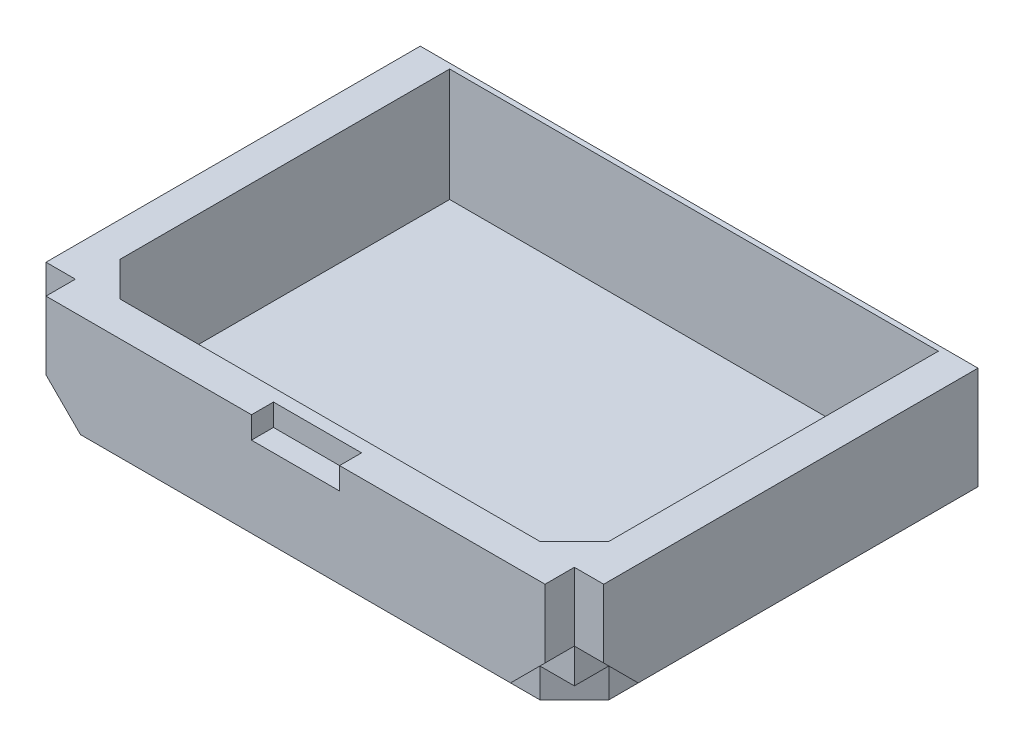
ISO-10303-21;
HEADER;
FILE_DESCRIPTION(('STEP AP214'),'2;1');
FILE_NAME('part.step','',(''),(''),'','','');
FILE_SCHEMA(('AUTOMOTIVE_DESIGN { 1 0 10303 214 1 1 1 1 }'));
ENDSEC;
DATA;
#1=APPLICATION_CONTEXT('core data for automotive mechanical design processes');
#2=APPLICATION_PROTOCOL_DEFINITION('international standard','automotive_design',2000,#1);
#3=PRODUCT_CONTEXT('',#1,'mechanical');
#4=PRODUCT('Part','Part','',(#3));
#5=PRODUCT_RELATED_PRODUCT_CATEGORY('part','',(#4));
#6=PRODUCT_DEFINITION_FORMATION('','',#4);
#7=PRODUCT_DEFINITION_CONTEXT('part definition',#1,'design');
#8=PRODUCT_DEFINITION('design','',#6,#7);
#9=PRODUCT_DEFINITION_SHAPE('','',#8);
#10=(LENGTH_UNIT() NAMED_UNIT(*) SI_UNIT(.MILLI.,.METRE.));
#11=(NAMED_UNIT(*) PLANE_ANGLE_UNIT() SI_UNIT($,.RADIAN.));
#12=(NAMED_UNIT(*) SI_UNIT($,.STERADIAN.) SOLID_ANGLE_UNIT());
#13=UNCERTAINTY_MEASURE_WITH_UNIT(LENGTH_MEASURE(1.E-05),#10,'distance_accuracy_value','');
#14=(GEOMETRIC_REPRESENTATION_CONTEXT(3) GLOBAL_UNCERTAINTY_ASSIGNED_CONTEXT((#13)) GLOBAL_UNIT_ASSIGNED_CONTEXT((#10,
#11,#12)) REPRESENTATION_CONTEXT('',''));
#15=CARTESIAN_POINT('',(0.,0.,0.));
#16=DIRECTION('',(0.,0.,1.));
#17=DIRECTION('',(1.,0.,0.));
#18=AXIS2_PLACEMENT_3D('',#15,#16,#17);
#19=CARTESIAN_POINT('',(170.,0.,137.5));
#20=DIRECTION('',(-1.,0.,0.));
#21=DIRECTION('',(0.,0.,1.));
#22=AXIS2_PLACEMENT_3D('',#19,#20,#21);
#23=PLANE('',#22);
#24=DIRECTION('',(0.,0.,1.));
#25=VECTOR('',#24,1.);
#26=CARTESIAN_POINT('',(170.,20.,117.5));
#27=LINE('',#26,#25);
#28=CARTESIAN_POINT('',(170.,20.,94.));
#29=VERTEX_POINT('',#28);
#30=CARTESIAN_POINT('',(170.,20.,117.5));
#31=VERTEX_POINT('',#30);
#32=EDGE_CURVE('E53',#29,#31,#27,.T.);
#33=ORIENTED_EDGE('',*,*,#32,.F.);
#34=DIRECTION('',(0.,0.707106781186548,0.707106781186547));
#35=VECTOR('',#34,1.);
#36=CARTESIAN_POINT('',(170.,43.5,117.5));
#37=LINE('',#36,#35);
#38=CARTESIAN_POINT('',(170.,43.5,117.5));
#39=VERTEX_POINT('',#38);
#40=EDGE_CURVE('E382',#29,#39,#37,.T.);
#41=ORIENTED_EDGE('',*,*,#40,.T.);
#42=DIRECTION('',(0.,-1.,0.));
#43=VECTOR('',#42,1.);
#44=CARTESIAN_POINT('',(170.,0.,117.5));
#45=LINE('',#44,#43);
#46=EDGE_CURVE('E244',#39,#31,#45,.T.);
#47=ORIENTED_EDGE('',*,*,#46,.T.);
#48=EDGE_LOOP('',(#33,#41,#47));
#49=FACE_BOUND('',#48,.T.);
#50=ADVANCED_FACE('F38',(#49),#23,.F.);
#51=CARTESIAN_POINT('',(-170.,0.,137.5));
#52=DIRECTION('',(1.,0.,0.));
#53=DIRECTION('',(0.,0.,-1.));
#54=AXIS2_PLACEMENT_3D('',#51,#52,#53);
#55=PLANE('',#54);
#56=DIRECTION('',(0.,0.,-1.));
#57=VECTOR('',#56,1.);
#58=CARTESIAN_POINT('',(-170.,20.,117.5));
#59=LINE('',#58,#57);
#60=CARTESIAN_POINT('',(-170.,20.,117.5));
#61=VERTEX_POINT('',#60);
#62=CARTESIAN_POINT('',(-170.,20.,94.));
#63=VERTEX_POINT('',#62);
#64=EDGE_CURVE('E223',#61,#63,#59,.T.);
#65=ORIENTED_EDGE('',*,*,#64,.F.);
#66=DIRECTION('',(0.,-1.,0.));
#67=VECTOR('',#66,1.);
#68=CARTESIAN_POINT('',(-170.,0.,117.5));
#69=LINE('',#68,#67);
#70=CARTESIAN_POINT('',(-170.,43.5,117.5));
#71=VERTEX_POINT('',#70);
#72=EDGE_CURVE('E235',#71,#61,#69,.T.);
#73=ORIENTED_EDGE('',*,*,#72,.F.);
#74=DIRECTION('',(0.,0.707106781186548,0.707106781186547));
#75=VECTOR('',#74,1.);
#76=CARTESIAN_POINT('',(-170.,43.5,117.5));
#77=LINE('',#76,#75);
#78=EDGE_CURVE('E237',#63,#71,#77,.T.);
#79=ORIENTED_EDGE('',*,*,#78,.F.);
#80=EDGE_LOOP('',(#65,#73,#79));
#81=FACE_BOUND('',#80,.T.);
#82=ADVANCED_FACE('F234',(#81),#55,.F.);
#83=CARTESIAN_POINT('',(-190.,0.,117.5));
#84=DIRECTION('',(0.,0.,-1.));
#85=DIRECTION('',(-1.,0.,0.));
#86=AXIS2_PLACEMENT_3D('',#83,#84,#85);
#87=PLANE('',#86);
#88=DIRECTION('',(-1.,0.,0.));
#89=VECTOR('',#88,1.);
#90=CARTESIAN_POINT('',(-146.5,20.,117.5));
#91=LINE('',#90,#89);
#92=CARTESIAN_POINT('',(-146.5,20.,117.5));
#93=VERTEX_POINT('',#92);
#94=EDGE_CURVE('E220',#93,#61,#91,.T.);
#95=ORIENTED_EDGE('',*,*,#94,.F.);
#96=DIRECTION('',(-0.707106781186547,0.707106781186548,0.));
#97=VECTOR('',#96,1.);
#98=CARTESIAN_POINT('',(-170.,43.5,117.5));
#99=LINE('',#98,#97);
#100=EDGE_CURVE('E242',#93,#71,#99,.T.);
#101=ORIENTED_EDGE('',*,*,#100,.T.);
#102=ORIENTED_EDGE('',*,*,#72,.T.);
#103=EDGE_LOOP('',(#95,#101,#102));
#104=FACE_BOUND('',#103,.T.);
#105=ADVANCED_FACE('F241',(#104),#87,.F.);
#106=DIRECTION('',(-1.,0.,0.));
#107=VECTOR('',#106,1.);
#108=CARTESIAN_POINT('',(146.5,20.,117.5));
#109=LINE('',#108,#107);
#110=CARTESIAN_POINT('',(146.5,20.,117.5));
#111=VERTEX_POINT('',#110);
#112=EDGE_CURVE('E572',#31,#111,#109,.T.);
#113=ORIENTED_EDGE('',*,*,#112,.F.);
#114=ORIENTED_EDGE('',*,*,#46,.F.);
#115=DIRECTION('',(-0.707106781186547,-0.707106781186548,0.));
#116=VECTOR('',#115,1.);
#117=CARTESIAN_POINT('',(170.,43.5,117.5));
#118=LINE('',#117,#116);
#119=EDGE_CURVE('E399',#39,#111,#118,.T.);
#120=ORIENTED_EDGE('',*,*,#119,.T.);
#121=EDGE_LOOP('',(#113,#114,#120));
#122=FACE_BOUND('',#121,.T.);
#123=ADVANCED_FACE('F571',(#122),#87,.F.);
#124=CARTESIAN_POINT('',(-190.,90.,137.5));
#125=DIRECTION('',(1.,0.,0.));
#126=DIRECTION('',(0.,0.,-1.));
#127=AXIS2_PLACEMENT_3D('',#124,#125,#126);
#128=PLANE('',#127);
#129=DIRECTION('',(0.,0.707106781186548,0.707106781186547));
#130=VECTOR('',#129,1.);
#131=CARTESIAN_POINT('',(-190.,43.5,117.5));
#132=LINE('',#131,#130);
#133=CARTESIAN_POINT('',(-190.,20.,94.));
#134=VERTEX_POINT('',#133);
#135=CARTESIAN_POINT('',(-190.,43.5,117.5));
#136=VERTEX_POINT('',#135);
#137=EDGE_CURVE('E932',#134,#136,#132,.T.);
#138=ORIENTED_EDGE('',*,*,#137,.T.);
#139=DIRECTION('',(0.,1.,0.));
#140=VECTOR('',#139,1.);
#141=CARTESIAN_POINT('',(-190.,0.,117.5));
#142=LINE('',#141,#140);
#143=CARTESIAN_POINT('',(-190.,90.,117.5));
#144=VERTEX_POINT('',#143);
#145=EDGE_CURVE('E297',#136,#144,#142,.T.);
#146=ORIENTED_EDGE('',*,*,#145,.T.);
#147=DIRECTION('',(0.,0.,1.));
#148=VECTOR('',#147,1.);
#149=CARTESIAN_POINT('',(-190.,90.,137.5));
#150=LINE('',#149,#148);
#151=CARTESIAN_POINT('',(-190.,90.,-137.5));
#152=VERTEX_POINT('',#151);
#153=EDGE_CURVE('E319',#152,#144,#150,.T.);
#154=ORIENTED_EDGE('',*,*,#153,.F.);
#155=DIRECTION('',(0.,-1.,0.));
#156=VECTOR('',#155,1.);
#157=CARTESIAN_POINT('',(-190.,90.,-137.5));
#158=LINE('',#157,#156);
#159=CARTESIAN_POINT('',(-190.,20.,-137.5));
#160=VERTEX_POINT('',#159);
#161=EDGE_CURVE('E11',#152,#160,#158,.T.);
#162=ORIENTED_EDGE('',*,*,#161,.T.);
#163=DIRECTION('',(0.,0.,1.));
#164=VECTOR('',#163,1.);
#165=CARTESIAN_POINT('',(-190.,20.,-137.5));
#166=LINE('',#165,#164);
#167=EDGE_CURVE('E271',#160,#134,#166,.T.);
#168=ORIENTED_EDGE('',*,*,#167,.T.);
#169=EDGE_LOOP('',(#138,#146,#154,#162,#168));
#170=FACE_BOUND('',#169,.T.);
#171=ADVANCED_FACE('F363',(#170),#128,.F.);
#172=DIRECTION('',(-1.,0.,0.));
#173=VECTOR('',#172,1.);
#174=CARTESIAN_POINT('',(-170.,43.5,117.5));
#175=LINE('',#174,#173);
#176=EDGE_CURVE('E942',#71,#136,#175,.T.);
#177=ORIENTED_EDGE('',*,*,#176,.F.);
#178=DIRECTION('',(0.,1.,0.));
#179=VECTOR('',#178,1.);
#180=CARTESIAN_POINT('',(-170.,0.,117.5));
#181=LINE('',#180,#179);
#182=CARTESIAN_POINT('',(-170.,90.,117.5));
#183=VERTEX_POINT('',#182);
#184=EDGE_CURVE('E300',#71,#183,#181,.T.);
#185=ORIENTED_EDGE('',*,*,#184,.T.);
#186=DIRECTION('',(-1.,0.,0.));
#187=VECTOR('',#186,1.);
#188=CARTESIAN_POINT('',(-190.,90.,117.5));
#189=LINE('',#188,#187);
#190=EDGE_CURVE('E290',#183,#144,#189,.T.);
#191=ORIENTED_EDGE('',*,*,#190,.T.);
#192=ORIENTED_EDGE('',*,*,#145,.F.);
#193=EDGE_LOOP('',(#177,#185,#191,#192));
#194=FACE_BOUND('',#193,.T.);
#195=ADVANCED_FACE('F609',(#194),#87,.F.);
#196=CARTESIAN_POINT('',(-190.,20.,-137.5));
#197=DIRECTION('',(0.,1.,0.));
#198=DIRECTION('',(0.,0.,1.));
#199=AXIS2_PLACEMENT_3D('',#196,#197,#198);
#200=PLANE('',#199);
#201=DIRECTION('',(-1.,0.,0.));
#202=VECTOR('',#201,1.);
#203=CARTESIAN_POINT('',(-170.,20.,94.));
#204=LINE('',#203,#202);
#205=EDGE_CURVE('E940',#63,#134,#204,.T.);
#206=ORIENTED_EDGE('',*,*,#205,.T.);
#207=ORIENTED_EDGE('',*,*,#167,.F.);
#208=DIRECTION('',(-1.,0.,0.));
#209=VECTOR('',#208,1.);
#210=CARTESIAN_POINT('',(-190.,20.,-137.5));
#211=LINE('',#210,#209);
#212=CARTESIAN_POINT('',(-170.,20.,-137.5));
#213=VERTEX_POINT('',#212);
#214=EDGE_CURVE('E266',#213,#160,#211,.T.);
#215=ORIENTED_EDGE('',*,*,#214,.F.);
#216=DIRECTION('',(0.,0.,1.));
#217=VECTOR('',#216,1.);
#218=CARTESIAN_POINT('',(-170.,20.,-137.5));
#219=LINE('',#218,#217);
#220=EDGE_CURVE('E270',#213,#63,#219,.T.);
#221=ORIENTED_EDGE('',*,*,#220,.T.);
#222=EDGE_LOOP('',(#206,#207,#215,#221));
#223=FACE_BOUND('',#222,.T.);
#224=ADVANCED_FACE('F606',(#223),#200,.F.);
#225=DIRECTION('',(0.,1.,0.));
#226=VECTOR('',#225,1.);
#227=CARTESIAN_POINT('',(170.,0.,117.5));
#228=LINE('',#227,#226);
#229=CARTESIAN_POINT('',(170.,90.,117.5));
#230=VERTEX_POINT('',#229);
#231=EDGE_CURVE('E313',#39,#230,#228,.T.);
#232=ORIENTED_EDGE('',*,*,#231,.F.);
#233=DIRECTION('',(1.,0.,0.));
#234=VECTOR('',#233,1.);
#235=CARTESIAN_POINT('',(170.,43.5,117.5));
#236=LINE('',#235,#234);
#237=CARTESIAN_POINT('',(190.,43.5,117.5));
#238=VERTEX_POINT('',#237);
#239=EDGE_CURVE('E378',#39,#238,#236,.T.);
#240=ORIENTED_EDGE('',*,*,#239,.T.);
#241=DIRECTION('',(0.,1.,0.));
#242=VECTOR('',#241,1.);
#243=CARTESIAN_POINT('',(190.,0.,117.5));
#244=LINE('',#243,#242);
#245=CARTESIAN_POINT('',(190.,90.,117.5));
#246=VERTEX_POINT('',#245);
#247=EDGE_CURVE('E306',#238,#246,#244,.T.);
#248=ORIENTED_EDGE('',*,*,#247,.T.);
#249=DIRECTION('',(-1.,0.,0.));
#250=VECTOR('',#249,1.);
#251=CARTESIAN_POINT('',(190.,90.,117.5));
#252=LINE('',#251,#250);
#253=EDGE_CURVE('E274',#246,#230,#252,.T.);
#254=ORIENTED_EDGE('',*,*,#253,.T.);
#255=EDGE_LOOP('',(#232,#240,#248,#254));
#256=FACE_BOUND('',#255,.T.);
#257=ADVANCED_FACE('F375',(#256),#87,.F.);
#258=DIRECTION('',(0.,0.,1.));
#259=VECTOR('',#258,1.);
#260=CARTESIAN_POINT('',(170.,20.,-137.5));
#261=LINE('',#260,#259);
#262=CARTESIAN_POINT('',(170.,20.,-137.5));
#263=VERTEX_POINT('',#262);
#264=EDGE_CURVE('E267',#263,#29,#261,.T.);
#265=ORIENTED_EDGE('',*,*,#264,.T.);
#266=DIRECTION('',(0.,-1.,0.));
#267=VECTOR('',#266,1.);
#268=CARTESIAN_POINT('',(170.,20.,94.));
#269=LINE('',#268,#267);
#270=CARTESIAN_POINT('',(170.,0.,94.));
#271=VERTEX_POINT('',#270);
#272=EDGE_CURVE('E565',#29,#271,#269,.T.);
#273=ORIENTED_EDGE('',*,*,#272,.T.);
#274=DIRECTION('',(0.,0.,1.));
#275=VECTOR('',#274,1.);
#276=CARTESIAN_POINT('',(170.,0.,137.5));
#277=LINE('',#276,#275);
#278=CARTESIAN_POINT('',(170.,0.,-137.5));
#279=VERTEX_POINT('',#278);
#280=EDGE_CURVE('E303',#279,#271,#277,.T.);
#281=ORIENTED_EDGE('',*,*,#280,.F.);
#282=DIRECTION('',(0.,-1.,0.));
#283=VECTOR('',#282,1.);
#284=CARTESIAN_POINT('',(170.,0.,-137.5));
#285=LINE('',#284,#283);
#286=EDGE_CURVE('E257',#263,#279,#285,.T.);
#287=ORIENTED_EDGE('',*,*,#286,.F.);
#288=EDGE_LOOP('',(#265,#273,#281,#287));
#289=FACE_BOUND('',#288,.T.);
#290=ADVANCED_FACE('F348',(#289),#23,.F.);
#291=DIRECTION('',(0.,0.,-1.));
#292=VECTOR('',#291,1.);
#293=CARTESIAN_POINT('',(-170.,0.,137.5));
#294=LINE('',#293,#292);
#295=CARTESIAN_POINT('',(-170.,0.,94.));
#296=VERTEX_POINT('',#295);
#297=CARTESIAN_POINT('',(-170.,0.,-137.5));
#298=VERTEX_POINT('',#297);
#299=EDGE_CURVE('E287',#296,#298,#294,.T.);
#300=ORIENTED_EDGE('',*,*,#299,.F.);
#301=DIRECTION('',(0.,-1.,0.));
#302=VECTOR('',#301,1.);
#303=CARTESIAN_POINT('',(-170.,20.,94.));
#304=LINE('',#303,#302);
#305=EDGE_CURVE('E926',#63,#296,#304,.T.);
#306=ORIENTED_EDGE('',*,*,#305,.F.);
#307=ORIENTED_EDGE('',*,*,#220,.F.);
#308=DIRECTION('',(0.,1.,0.));
#309=VECTOR('',#308,1.);
#310=CARTESIAN_POINT('',(-170.,0.,-137.5));
#311=LINE('',#310,#309);
#312=EDGE_CURVE('E263',#298,#213,#311,.T.);
#313=ORIENTED_EDGE('',*,*,#312,.F.);
#314=EDGE_LOOP('',(#300,#306,#307,#313));
#315=FACE_BOUND('',#314,.T.);
#316=ADVANCED_FACE('F358',(#315),#55,.F.);
#317=CARTESIAN_POINT('',(-190.,90.,-137.5));
#318=DIRECTION('',(0.,0.,1.));
#319=DIRECTION('',(1.,0.,0.));
#320=AXIS2_PLACEMENT_3D('',#317,#318,#319);
#321=PLANE('',#320);
#322=ORIENTED_EDGE('',*,*,#312,.T.);
#323=ORIENTED_EDGE('',*,*,#214,.T.);
#324=ORIENTED_EDGE('',*,*,#161,.F.);
#325=DIRECTION('',(-1.,0.,0.));
#326=VECTOR('',#325,1.);
#327=CARTESIAN_POINT('',(-190.,90.,-137.5));
#328=LINE('',#327,#326);
#329=CARTESIAN_POINT('',(190.,90.,-137.5));
#330=VERTEX_POINT('',#329);
#331=EDGE_CURVE('E316',#330,#152,#328,.T.);
#332=ORIENTED_EDGE('',*,*,#331,.F.);
#333=DIRECTION('',(0.,-1.,0.));
#334=VECTOR('',#333,1.);
#335=CARTESIAN_POINT('',(190.,90.,-137.5));
#336=LINE('',#335,#334);
#337=CARTESIAN_POINT('',(190.,20.,-137.5));
#338=VERTEX_POINT('',#337);
#339=EDGE_CURVE('E46',#330,#338,#336,.T.);
#340=ORIENTED_EDGE('',*,*,#339,.T.);
#341=DIRECTION('',(-1.,0.,0.));
#342=VECTOR('',#341,1.);
#343=CARTESIAN_POINT('',(170.,20.,-137.5));
#344=LINE('',#343,#342);
#345=EDGE_CURVE('E279',#338,#263,#344,.T.);
#346=ORIENTED_EDGE('',*,*,#345,.T.);
#347=ORIENTED_EDGE('',*,*,#286,.T.);
#348=DIRECTION('',(-1.,0.,0.));
#349=VECTOR('',#348,1.);
#350=CARTESIAN_POINT('',(-190.,0.,-137.5));
#351=LINE('',#350,#349);
#352=EDGE_CURVE('E299',#279,#298,#351,.T.);
#353=ORIENTED_EDGE('',*,*,#352,.T.);
#354=EDGE_LOOP('',(#322,#323,#324,#332,#340,#346,#347,#353));
#355=FACE_BOUND('',#354,.T.);
#356=ADVANCED_FACE('F40',(#355),#321,.F.);
#357=CARTESIAN_POINT('',(-190.,90.,137.5));
#358=DIRECTION('',(0.,0.,-1.));
#359=DIRECTION('',(-1.,0.,0.));
#360=AXIS2_PLACEMENT_3D('',#357,#358,#359);
#361=PLANE('',#360);
#362=DIRECTION('',(0.,1.,0.));
#363=VECTOR('',#362,1.);
#364=CARTESIAN_POINT('',(-170.,0.,137.5));
#365=LINE('',#364,#363);
#366=CARTESIAN_POINT('',(-170.,43.5,137.5));
#367=VERTEX_POINT('',#366);
#368=CARTESIAN_POINT('',(-170.,90.,137.5));
#369=VERTEX_POINT('',#368);
#370=EDGE_CURVE('E289',#367,#369,#365,.T.);
#371=ORIENTED_EDGE('',*,*,#370,.F.);
#372=DIRECTION('',(-0.707106781186547,0.707106781186548,0.));
#373=VECTOR('',#372,1.);
#374=CARTESIAN_POINT('',(-170.,43.5,137.5));
#375=LINE('',#374,#373);
#376=CARTESIAN_POINT('',(-146.5,20.,137.5));
#377=VERTEX_POINT('',#376);
#378=EDGE_CURVE('E391',#377,#367,#375,.T.);
#379=ORIENTED_EDGE('',*,*,#378,.F.);
#380=DIRECTION('',(-1.,0.,0.));
#381=VECTOR('',#380,1.);
#382=CARTESIAN_POINT('',(170.,20.,137.5));
#383=LINE('',#382,#381);
#384=CARTESIAN_POINT('',(146.5,20.,137.5));
#385=VERTEX_POINT('',#384);
#386=EDGE_CURVE('E248',#385,#377,#383,.T.);
#387=ORIENTED_EDGE('',*,*,#386,.F.);
#388=DIRECTION('',(-0.707106781186547,-0.707106781186548,0.));
#389=VECTOR('',#388,1.);
#390=CARTESIAN_POINT('',(170.,43.5,137.5));
#391=LINE('',#390,#389);
#392=CARTESIAN_POINT('',(170.,43.5,137.5));
#393=VERTEX_POINT('',#392);
#394=EDGE_CURVE('E384',#393,#385,#391,.T.);
#395=ORIENTED_EDGE('',*,*,#394,.F.);
#396=DIRECTION('',(0.,1.,0.));
#397=VECTOR('',#396,1.);
#398=CARTESIAN_POINT('',(170.,0.,137.5));
#399=LINE('',#398,#397);
#400=CARTESIAN_POINT('',(170.,90.,137.5));
#401=VERTEX_POINT('',#400);
#402=EDGE_CURVE('E294',#393,#401,#399,.T.);
#403=ORIENTED_EDGE('',*,*,#402,.T.);
#404=DIRECTION('',(1.,0.,0.));
#405=VECTOR('',#404,1.);
#406=CARTESIAN_POINT('',(-190.,90.,137.5));
#407=LINE('',#406,#405);
#408=CARTESIAN_POINT('',(30.,90.,137.5));
#409=VERTEX_POINT('',#408);
#410=EDGE_CURVE('E322',#409,#401,#407,.T.);
#411=ORIENTED_EDGE('',*,*,#410,.F.);
#412=DIRECTION('',(0.,1.,0.));
#413=VECTOR('',#412,1.);
#414=CARTESIAN_POINT('',(30.,90.,137.5));
#415=LINE('',#414,#413);
#416=CARTESIAN_POINT('',(30.,75.,137.5));
#417=VERTEX_POINT('',#416);
#418=EDGE_CURVE('E411',#417,#409,#415,.T.);
#419=ORIENTED_EDGE('',*,*,#418,.F.);
#420=DIRECTION('',(1.,0.,0.));
#421=VECTOR('',#420,1.);
#422=CARTESIAN_POINT('',(-30.,75.,137.5));
#423=LINE('',#422,#421);
#424=CARTESIAN_POINT('',(-30.,75.,137.5));
#425=VERTEX_POINT('',#424);
#426=EDGE_CURVE('E419',#425,#417,#423,.T.);
#427=ORIENTED_EDGE('',*,*,#426,.F.);
#428=DIRECTION('',(0.,-1.,0.));
#429=VECTOR('',#428,1.);
#430=CARTESIAN_POINT('',(-30.,90.,137.5));
#431=LINE('',#430,#429);
#432=CARTESIAN_POINT('',(-30.,90.,137.5));
#433=VERTEX_POINT('',#432);
#434=EDGE_CURVE('E397',#433,#425,#431,.T.);
#435=ORIENTED_EDGE('',*,*,#434,.F.);
#436=EDGE_CURVE('E323',#369,#433,#407,.T.);
#437=ORIENTED_EDGE('',*,*,#436,.F.);
#438=EDGE_LOOP('',(#371,#379,#387,#395,#403,#411,#419,#427,#435,#437));
#439=FACE_BOUND('',#438,.T.);
#440=ADVANCED_FACE('F535',(#439),#361,.F.);
#441=CARTESIAN_POINT('',(190.,90.,137.5));
#442=DIRECTION('',(-1.,0.,0.));
#443=DIRECTION('',(0.,0.,1.));
#444=AXIS2_PLACEMENT_3D('',#441,#442,#443);
#445=PLANE('',#444);
#446=ORIENTED_EDGE('',*,*,#247,.F.);
#447=DIRECTION('',(0.,0.707106781186548,0.707106781186547));
#448=VECTOR('',#447,1.);
#449=CARTESIAN_POINT('',(190.,43.5,117.5));
#450=LINE('',#449,#448);
#451=CARTESIAN_POINT('',(190.,20.,94.));
#452=VERTEX_POINT('',#451);
#453=EDGE_CURVE('E340',#452,#238,#450,.T.);
#454=ORIENTED_EDGE('',*,*,#453,.F.);
#455=DIRECTION('',(0.,0.,1.));
#456=VECTOR('',#455,1.);
#457=CARTESIAN_POINT('',(190.,20.,-137.5));
#458=LINE('',#457,#456);
#459=EDGE_CURVE('E282',#338,#452,#458,.T.);
#460=ORIENTED_EDGE('',*,*,#459,.F.);
#461=ORIENTED_EDGE('',*,*,#339,.F.);
#462=DIRECTION('',(0.,0.,-1.));
#463=VECTOR('',#462,1.);
#464=CARTESIAN_POINT('',(190.,90.,137.5));
#465=LINE('',#464,#463);
#466=EDGE_CURVE('E326',#246,#330,#465,.T.);
#467=ORIENTED_EDGE('',*,*,#466,.F.);
#468=EDGE_LOOP('',(#446,#454,#460,#461,#467));
#469=FACE_BOUND('',#468,.T.);
#470=ADVANCED_FACE('F338',(#469),#445,.F.);
#471=CARTESIAN_POINT('',(0.,90.,0.));
#472=DIRECTION('',(0.,1.,0.));
#473=DIRECTION('',(0.,0.,1.));
#474=AXIS2_PLACEMENT_3D('',#471,#472,#473);
#475=PLANE('',#474);
#476=DIRECTION('',(0.,0.,1.));
#477=VECTOR('',#476,1.);
#478=CARTESIAN_POINT('',(-30.,90.,122.5));
#479=LINE('',#478,#477);
#480=CARTESIAN_POINT('',(-30.,90.,122.5));
#481=VERTEX_POINT('',#480);
#482=EDGE_CURVE('E423',#481,#433,#479,.T.);
#483=ORIENTED_EDGE('',*,*,#482,.F.);
#484=DIRECTION('',(-1.,0.,0.));
#485=VECTOR('',#484,1.);
#486=CARTESIAN_POINT('',(-30.,90.,122.5));
#487=LINE('',#486,#485);
#488=CARTESIAN_POINT('',(30.,90.,122.5));
#489=VERTEX_POINT('',#488);
#490=EDGE_CURVE('E414',#489,#481,#487,.T.);
#491=ORIENTED_EDGE('',*,*,#490,.F.);
#492=DIRECTION('',(0.,0.,1.));
#493=VECTOR('',#492,1.);
#494=CARTESIAN_POINT('',(30.,90.,122.5));
#495=LINE('',#494,#493);
#496=EDGE_CURVE('E426',#489,#409,#495,.T.);
#497=ORIENTED_EDGE('',*,*,#496,.T.);
#498=ORIENTED_EDGE('',*,*,#410,.T.);
#499=DIRECTION('',(0.,0.,1.));
#500=VECTOR('',#499,1.);
#501=CARTESIAN_POINT('',(170.,90.,137.5));
#502=LINE('',#501,#500);
#503=EDGE_CURVE('E307',#230,#401,#502,.T.);
#504=ORIENTED_EDGE('',*,*,#503,.F.);
#505=ORIENTED_EDGE('',*,*,#253,.F.);
#506=ORIENTED_EDGE('',*,*,#466,.T.);
#507=ORIENTED_EDGE('',*,*,#331,.T.);
#508=ORIENTED_EDGE('',*,*,#153,.T.);
#509=ORIENTED_EDGE('',*,*,#190,.F.);
#510=DIRECTION('',(0.,0.,-1.));
#511=VECTOR('',#510,1.);
#512=CARTESIAN_POINT('',(-170.,90.,137.5));
#513=LINE('',#512,#511);
#514=EDGE_CURVE('E291',#369,#183,#513,.T.);
#515=ORIENTED_EDGE('',*,*,#514,.F.);
#516=ORIENTED_EDGE('',*,*,#436,.T.);
#517=EDGE_LOOP('',(#483,#491,#497,#498,#504,#505,#506,#507,#508,#509,#515,#516));
#518=FACE_BOUND('',#517,.T.);
#519=DIRECTION('',(0.,0.,-1.));
#520=VECTOR('',#519,1.);
#521=CARTESIAN_POINT('',(166.5,90.,-134.));
#522=LINE('',#521,#520);
#523=CARTESIAN_POINT('',(166.5,90.,90.5));
#524=VERTEX_POINT('',#523);
#525=CARTESIAN_POINT('',(166.5,90.,-134.));
#526=VERTEX_POINT('',#525);
#527=EDGE_CURVE('E425',#524,#526,#522,.T.);
#528=ORIENTED_EDGE('',*,*,#527,.F.);
#529=DIRECTION('',(0.707106781186547,0.,-0.707106781186547));
#530=VECTOR('',#529,1.);
#531=CARTESIAN_POINT('',(143.,90.,114.));
#532=LINE('',#531,#530);
#533=CARTESIAN_POINT('',(143.,90.,114.));
#534=VERTEX_POINT('',#533);
#535=EDGE_CURVE('E436',#534,#524,#532,.T.);
#536=ORIENTED_EDGE('',*,*,#535,.F.);
#537=DIRECTION('',(1.,0.,0.));
#538=VECTOR('',#537,1.);
#539=CARTESIAN_POINT('',(-143.,90.,114.));
#540=LINE('',#539,#538);
#541=CARTESIAN_POINT('',(-143.,90.,114.));
#542=VERTEX_POINT('',#541);
#543=EDGE_CURVE('E462',#542,#534,#540,.T.);
#544=ORIENTED_EDGE('',*,*,#543,.F.);
#545=DIRECTION('',(0.707106781186547,0.,0.707106781186547));
#546=VECTOR('',#545,1.);
#547=CARTESIAN_POINT('',(-143.,90.,114.));
#548=LINE('',#547,#546);
#549=CARTESIAN_POINT('',(-166.5,90.,90.5));
#550=VERTEX_POINT('',#549);
#551=EDGE_CURVE('E459',#550,#542,#548,.T.);
#552=ORIENTED_EDGE('',*,*,#551,.F.);
#553=DIRECTION('',(0.,0.,1.));
#554=VECTOR('',#553,1.);
#555=CARTESIAN_POINT('',(-166.5,90.,-134.));
#556=LINE('',#555,#554);
#557=CARTESIAN_POINT('',(-166.5,90.,-134.));
#558=VERTEX_POINT('',#557);
#559=EDGE_CURVE('E456',#558,#550,#556,.T.);
#560=ORIENTED_EDGE('',*,*,#559,.F.);
#561=DIRECTION('',(-1.,0.,0.));
#562=VECTOR('',#561,1.);
#563=CARTESIAN_POINT('',(-166.5,90.,-134.));
#564=LINE('',#563,#562);
#565=EDGE_CURVE('E453',#526,#558,#564,.T.);
#566=ORIENTED_EDGE('',*,*,#565,.F.);
#567=EDGE_LOOP('',(#528,#536,#544,#552,#560,#566));
#568=FACE_BOUND('',#567,.T.);
#569=ADVANCED_FACE('F368',(#518,#568),#475,.T.);
#570=CARTESIAN_POINT('',(0.,0.,0.));
#571=DIRECTION('',(0.,1.,0.));
#572=DIRECTION('',(0.,0.,1.));
#573=AXIS2_PLACEMENT_3D('',#570,#571,#572);
#574=PLANE('',#573);
#575=DIRECTION('',(-1.,0.,0.));
#576=VECTOR('',#575,1.);
#577=CARTESIAN_POINT('',(170.,0.,117.5));
#578=LINE('',#577,#576);
#579=CARTESIAN_POINT('',(146.5,0.,117.5));
#580=VERTEX_POINT('',#579);
#581=CARTESIAN_POINT('',(-146.5,0.,117.5));
#582=VERTEX_POINT('',#581);
#583=EDGE_CURVE('E254',#580,#582,#578,.T.);
#584=ORIENTED_EDGE('',*,*,#583,.T.);
#585=DIRECTION('',(0.707106781186548,0.,0.707106781186547));
#586=VECTOR('',#585,1.);
#587=CARTESIAN_POINT('',(-170.,0.,94.));
#588=LINE('',#587,#586);
#589=EDGE_CURVE('E356',#296,#582,#588,.T.);
#590=ORIENTED_EDGE('',*,*,#589,.F.);
#591=ORIENTED_EDGE('',*,*,#299,.T.);
#592=ORIENTED_EDGE('',*,*,#352,.F.);
#593=ORIENTED_EDGE('',*,*,#280,.T.);
#594=DIRECTION('',(0.707106781186548,0.,-0.707106781186547));
#595=VECTOR('',#594,1.);
#596=CARTESIAN_POINT('',(170.,0.,94.));
#597=LINE('',#596,#595);
#598=EDGE_CURVE('E935',#580,#271,#597,.T.);
#599=ORIENTED_EDGE('',*,*,#598,.F.);
#600=EDGE_LOOP('',(#584,#590,#591,#592,#593,#599));
#601=FACE_BOUND('',#600,.T.);
#602=ADVANCED_FACE('F351',(#601),#574,.F.);
#603=ORIENTED_EDGE('',*,*,#402,.F.);
#604=DIRECTION('',(0.,0.,1.));
#605=VECTOR('',#604,1.);
#606=CARTESIAN_POINT('',(170.,43.5,117.5));
#607=LINE('',#606,#605);
#608=EDGE_CURVE('E402',#39,#393,#607,.T.);
#609=ORIENTED_EDGE('',*,*,#608,.F.);
#610=ORIENTED_EDGE('',*,*,#231,.T.);
#611=ORIENTED_EDGE('',*,*,#503,.T.);
#612=EDGE_LOOP('',(#603,#609,#610,#611));
#613=FACE_BOUND('',#612,.T.);
#614=ADVANCED_FACE('F511',(#613),#23,.F.);
#615=DIRECTION('',(-1.,0.,0.));
#616=VECTOR('',#615,1.);
#617=CARTESIAN_POINT('',(170.,20.,117.5));
#618=LINE('',#617,#616);
#619=EDGE_CURVE('E258',#111,#93,#618,.T.);
#620=ORIENTED_EDGE('',*,*,#619,.T.);
#621=DIRECTION('',(0.,-1.,0.));
#622=VECTOR('',#621,1.);
#623=CARTESIAN_POINT('',(-146.5,20.,117.5));
#624=LINE('',#623,#622);
#625=EDGE_CURVE('E239',#93,#582,#624,.T.);
#626=ORIENTED_EDGE('',*,*,#625,.T.);
#627=ORIENTED_EDGE('',*,*,#583,.F.);
#628=DIRECTION('',(0.,-1.,0.));
#629=VECTOR('',#628,1.);
#630=CARTESIAN_POINT('',(146.5,20.,117.5));
#631=LINE('',#630,#629);
#632=EDGE_CURVE('E562',#111,#580,#631,.T.);
#633=ORIENTED_EDGE('',*,*,#632,.F.);
#634=EDGE_LOOP('',(#620,#626,#627,#633));
#635=FACE_BOUND('',#634,.T.);
#636=ADVANCED_FACE('F520',(#635),#87,.F.);
#637=ORIENTED_EDGE('',*,*,#184,.F.);
#638=DIRECTION('',(0.,0.,1.));
#639=VECTOR('',#638,1.);
#640=CARTESIAN_POINT('',(-170.,43.5,117.5));
#641=LINE('',#640,#639);
#642=EDGE_CURVE('E394',#71,#367,#641,.T.);
#643=ORIENTED_EDGE('',*,*,#642,.T.);
#644=ORIENTED_EDGE('',*,*,#370,.T.);
#645=ORIENTED_EDGE('',*,*,#514,.T.);
#646=EDGE_LOOP('',(#637,#643,#644,#645));
#647=FACE_BOUND('',#646,.T.);
#648=ADVANCED_FACE('F516',(#647),#55,.F.);
#649=CARTESIAN_POINT('',(170.,20.,-137.5));
#650=DIRECTION('',(0.,1.,0.));
#651=DIRECTION('',(0.,0.,1.));
#652=AXIS2_PLACEMENT_3D('',#649,#650,#651);
#653=PLANE('',#652);
#654=ORIENTED_EDGE('',*,*,#459,.T.);
#655=DIRECTION('',(1.,0.,0.));
#656=VECTOR('',#655,1.);
#657=CARTESIAN_POINT('',(170.,20.,94.));
#658=LINE('',#657,#656);
#659=EDGE_CURVE('E344',#29,#452,#658,.T.);
#660=ORIENTED_EDGE('',*,*,#659,.F.);
#661=ORIENTED_EDGE('',*,*,#264,.F.);
#662=ORIENTED_EDGE('',*,*,#345,.F.);
#663=EDGE_LOOP('',(#654,#660,#661,#662));
#664=FACE_BOUND('',#663,.T.);
#665=ADVANCED_FACE('F343',(#664),#653,.F.);
#666=CARTESIAN_POINT('',(170.,20.,137.5));
#667=DIRECTION('',(0.,1.,0.));
#668=DIRECTION('',(0.,0.,1.));
#669=AXIS2_PLACEMENT_3D('',#666,#667,#668);
#670=PLANE('',#669);
#671=ORIENTED_EDGE('',*,*,#386,.T.);
#672=DIRECTION('',(0.,0.,1.));
#673=VECTOR('',#672,1.);
#674=CARTESIAN_POINT('',(-146.5,20.,117.5));
#675=LINE('',#674,#673);
#676=EDGE_CURVE('E390',#93,#377,#675,.T.);
#677=ORIENTED_EDGE('',*,*,#676,.F.);
#678=ORIENTED_EDGE('',*,*,#619,.F.);
#679=DIRECTION('',(0.,0.,1.));
#680=VECTOR('',#679,1.);
#681=CARTESIAN_POINT('',(146.5,20.,117.5));
#682=LINE('',#681,#680);
#683=EDGE_CURVE('E393',#111,#385,#682,.T.);
#684=ORIENTED_EDGE('',*,*,#683,.T.);
#685=EDGE_LOOP('',(#671,#677,#678,#684));
#686=FACE_BOUND('',#685,.T.);
#687=ADVANCED_FACE('F558',(#686),#670,.F.);
#688=CARTESIAN_POINT('',(166.5,13.,-134.));
#689=DIRECTION('',(1.,0.,0.));
#690=DIRECTION('',(0.,0.,-1.));
#691=AXIS2_PLACEMENT_3D('',#688,#689,#690);
#692=PLANE('',#691);
#693=ORIENTED_EDGE('',*,*,#527,.T.);
#694=DIRECTION('',(0.,1.,0.));
#695=VECTOR('',#694,1.);
#696=CARTESIAN_POINT('',(166.5,13.,-134.));
#697=LINE('',#696,#695);
#698=CARTESIAN_POINT('',(166.5,13.,-134.));
#699=VERTEX_POINT('',#698);
#700=EDGE_CURVE('E451',#699,#526,#697,.T.);
#701=ORIENTED_EDGE('',*,*,#700,.F.);
#702=DIRECTION('',(0.,0.,-1.));
#703=VECTOR('',#702,1.);
#704=CARTESIAN_POINT('',(166.5,13.,-134.));
#705=LINE('',#704,#703);
#706=CARTESIAN_POINT('',(166.5,13.,90.5));
#707=VERTEX_POINT('',#706);
#708=EDGE_CURVE('E432',#707,#699,#705,.T.);
#709=ORIENTED_EDGE('',*,*,#708,.F.);
#710=DIRECTION('',(0.,1.,0.));
#711=VECTOR('',#710,1.);
#712=CARTESIAN_POINT('',(166.5,13.,90.5));
#713=LINE('',#712,#711);
#714=EDGE_CURVE('E245',#707,#524,#713,.T.);
#715=ORIENTED_EDGE('',*,*,#714,.T.);
#716=EDGE_LOOP('',(#693,#701,#709,#715));
#717=FACE_BOUND('',#716,.T.);
#718=ADVANCED_FACE('F492',(#717),#692,.F.);
#719=CARTESIAN_POINT('',(143.,13.,114.));
#720=DIRECTION('',(0.707106781186548,0.,0.707106781186548));
#721=DIRECTION('',(0.707106781186548,0.,-0.707106781186548));
#722=AXIS2_PLACEMENT_3D('',#719,#720,#721);
#723=PLANE('',#722);
#724=ORIENTED_EDGE('',*,*,#535,.T.);
#725=ORIENTED_EDGE('',*,*,#714,.F.);
#726=DIRECTION('',(0.707106781186547,0.,-0.707106781186547));
#727=VECTOR('',#726,1.);
#728=CARTESIAN_POINT('',(143.,13.,114.));
#729=LINE('',#728,#727);
#730=CARTESIAN_POINT('',(143.,13.,114.));
#731=VERTEX_POINT('',#730);
#732=EDGE_CURVE('E448',#731,#707,#729,.T.);
#733=ORIENTED_EDGE('',*,*,#732,.F.);
#734=DIRECTION('',(0.,1.,0.));
#735=VECTOR('',#734,1.);
#736=CARTESIAN_POINT('',(143.,13.,114.));
#737=LINE('',#736,#735);
#738=EDGE_CURVE('E250',#731,#534,#737,.T.);
#739=ORIENTED_EDGE('',*,*,#738,.T.);
#740=EDGE_LOOP('',(#724,#725,#733,#739));
#741=FACE_BOUND('',#740,.T.);
#742=ADVANCED_FACE('F494',(#741),#723,.F.);
#743=CARTESIAN_POINT('',(-143.,13.,114.));
#744=DIRECTION('',(0.,0.,1.));
#745=DIRECTION('',(1.,0.,0.));
#746=AXIS2_PLACEMENT_3D('',#743,#744,#745);
#747=PLANE('',#746);
#748=ORIENTED_EDGE('',*,*,#543,.T.);
#749=ORIENTED_EDGE('',*,*,#738,.F.);
#750=DIRECTION('',(1.,0.,0.));
#751=VECTOR('',#750,1.);
#752=CARTESIAN_POINT('',(-143.,13.,114.));
#753=LINE('',#752,#751);
#754=CARTESIAN_POINT('',(-143.,13.,114.));
#755=VERTEX_POINT('',#754);
#756=EDGE_CURVE('E445',#755,#731,#753,.T.);
#757=ORIENTED_EDGE('',*,*,#756,.F.);
#758=DIRECTION('',(0.,1.,0.));
#759=VECTOR('',#758,1.);
#760=CARTESIAN_POINT('',(-143.,13.,114.));
#761=LINE('',#760,#759);
#762=EDGE_CURVE('E468',#755,#542,#761,.T.);
#763=ORIENTED_EDGE('',*,*,#762,.T.);
#764=EDGE_LOOP('',(#748,#749,#757,#763));
#765=FACE_BOUND('',#764,.T.);
#766=ADVANCED_FACE('F496',(#765),#747,.F.);
#767=CARTESIAN_POINT('',(-143.,13.,114.));
#768=DIRECTION('',(-0.707106781186548,0.,0.707106781186548));
#769=DIRECTION('',(0.707106781186548,0.,0.707106781186548));
#770=AXIS2_PLACEMENT_3D('',#767,#768,#769);
#771=PLANE('',#770);
#772=ORIENTED_EDGE('',*,*,#551,.T.);
#773=ORIENTED_EDGE('',*,*,#762,.F.);
#774=DIRECTION('',(0.707106781186547,0.,0.707106781186547));
#775=VECTOR('',#774,1.);
#776=CARTESIAN_POINT('',(-143.,13.,114.));
#777=LINE('',#776,#775);
#778=CARTESIAN_POINT('',(-166.5,13.,90.5));
#779=VERTEX_POINT('',#778);
#780=EDGE_CURVE('E442',#779,#755,#777,.T.);
#781=ORIENTED_EDGE('',*,*,#780,.F.);
#782=DIRECTION('',(0.,1.,0.));
#783=VECTOR('',#782,1.);
#784=CARTESIAN_POINT('',(-166.5,13.,90.5));
#785=LINE('',#784,#783);
#786=EDGE_CURVE('E470',#779,#550,#785,.T.);
#787=ORIENTED_EDGE('',*,*,#786,.T.);
#788=EDGE_LOOP('',(#772,#773,#781,#787));
#789=FACE_BOUND('',#788,.T.);
#790=ADVANCED_FACE('F499',(#789),#771,.F.);
#791=CARTESIAN_POINT('',(-166.5,13.,-134.));
#792=DIRECTION('',(-1.,0.,0.));
#793=DIRECTION('',(0.,0.,1.));
#794=AXIS2_PLACEMENT_3D('',#791,#792,#793);
#795=PLANE('',#794);
#796=ORIENTED_EDGE('',*,*,#559,.T.);
#797=ORIENTED_EDGE('',*,*,#786,.F.);
#798=DIRECTION('',(0.,0.,1.));
#799=VECTOR('',#798,1.);
#800=CARTESIAN_POINT('',(-166.5,13.,-134.));
#801=LINE('',#800,#799);
#802=CARTESIAN_POINT('',(-166.5,13.,-134.));
#803=VERTEX_POINT('',#802);
#804=EDGE_CURVE('E439',#803,#779,#801,.T.);
#805=ORIENTED_EDGE('',*,*,#804,.F.);
#806=DIRECTION('',(0.,1.,0.));
#807=VECTOR('',#806,1.);
#808=CARTESIAN_POINT('',(-166.5,13.,-134.));
#809=LINE('',#808,#807);
#810=EDGE_CURVE('E472',#803,#558,#809,.T.);
#811=ORIENTED_EDGE('',*,*,#810,.T.);
#812=EDGE_LOOP('',(#796,#797,#805,#811));
#813=FACE_BOUND('',#812,.T.);
#814=ADVANCED_FACE('F486',(#813),#795,.F.);
#815=CARTESIAN_POINT('',(-166.5,13.,-134.));
#816=DIRECTION('',(0.,0.,-1.));
#817=DIRECTION('',(-1.,0.,0.));
#818=AXIS2_PLACEMENT_3D('',#815,#816,#817);
#819=PLANE('',#818);
#820=ORIENTED_EDGE('',*,*,#565,.T.);
#821=ORIENTED_EDGE('',*,*,#810,.F.);
#822=DIRECTION('',(-1.,0.,0.));
#823=VECTOR('',#822,1.);
#824=CARTESIAN_POINT('',(-166.5,13.,-134.));
#825=LINE('',#824,#823);
#826=EDGE_CURVE('E435',#699,#803,#825,.T.);
#827=ORIENTED_EDGE('',*,*,#826,.F.);
#828=ORIENTED_EDGE('',*,*,#700,.T.);
#829=EDGE_LOOP('',(#820,#821,#827,#828));
#830=FACE_BOUND('',#829,.T.);
#831=ADVANCED_FACE('F477',(#830),#819,.F.);
#832=CARTESIAN_POINT('',(0.,13.,0.));
#833=DIRECTION('',(0.,1.,0.));
#834=DIRECTION('',(0.,0.,1.));
#835=AXIS2_PLACEMENT_3D('',#832,#833,#834);
#836=PLANE('',#835);
#837=ORIENTED_EDGE('',*,*,#708,.T.);
#838=ORIENTED_EDGE('',*,*,#826,.T.);
#839=ORIENTED_EDGE('',*,*,#804,.T.);
#840=ORIENTED_EDGE('',*,*,#780,.T.);
#841=ORIENTED_EDGE('',*,*,#756,.T.);
#842=ORIENTED_EDGE('',*,*,#732,.T.);
#843=EDGE_LOOP('',(#837,#838,#839,#840,#841,#842));
#844=FACE_BOUND('',#843,.T.);
#845=ADVANCED_FACE('F490',(#844),#836,.T.);
#846=CARTESIAN_POINT('',(-30.,90.,122.5));
#847=DIRECTION('',(-1.,0.,0.));
#848=DIRECTION('',(0.,0.,1.));
#849=AXIS2_PLACEMENT_3D('',#846,#847,#848);
#850=PLANE('',#849);
#851=ORIENTED_EDGE('',*,*,#434,.T.);
#852=DIRECTION('',(0.,0.,1.));
#853=VECTOR('',#852,1.);
#854=CARTESIAN_POINT('',(-30.,75.,122.5));
#855=LINE('',#854,#853);
#856=CARTESIAN_POINT('',(-30.,75.,122.5));
#857=VERTEX_POINT('',#856);
#858=EDGE_CURVE('E416',#857,#425,#855,.T.);
#859=ORIENTED_EDGE('',*,*,#858,.F.);
#860=DIRECTION('',(0.,-1.,0.));
#861=VECTOR('',#860,1.);
#862=CARTESIAN_POINT('',(-30.,90.,122.5));
#863=LINE('',#862,#861);
#864=EDGE_CURVE('E407',#481,#857,#863,.T.);
#865=ORIENTED_EDGE('',*,*,#864,.F.);
#866=ORIENTED_EDGE('',*,*,#482,.T.);
#867=EDGE_LOOP('',(#851,#859,#865,#866));
#868=FACE_BOUND('',#867,.T.);
#869=ADVANCED_FACE('F548',(#868),#850,.F.);
#870=CARTESIAN_POINT('',(30.,90.,122.5));
#871=DIRECTION('',(1.,0.,0.));
#872=DIRECTION('',(0.,1.,0.));
#873=AXIS2_PLACEMENT_3D('',#870,#871,#872);
#874=PLANE('',#873);
#875=ORIENTED_EDGE('',*,*,#418,.T.);
#876=ORIENTED_EDGE('',*,*,#496,.F.);
#877=DIRECTION('',(0.,1.,0.));
#878=VECTOR('',#877,1.);
#879=CARTESIAN_POINT('',(30.,90.,122.5));
#880=LINE('',#879,#878);
#881=CARTESIAN_POINT('',(30.,75.,122.5));
#882=VERTEX_POINT('',#881);
#883=EDGE_CURVE('E61',#882,#489,#880,.T.);
#884=ORIENTED_EDGE('',*,*,#883,.F.);
#885=DIRECTION('',(0.,0.,1.));
#886=VECTOR('',#885,1.);
#887=CARTESIAN_POINT('',(30.,75.,122.5));
#888=LINE('',#887,#886);
#889=EDGE_CURVE('E429',#882,#417,#888,.T.);
#890=ORIENTED_EDGE('',*,*,#889,.T.);
#891=EDGE_LOOP('',(#875,#876,#884,#890));
#892=FACE_BOUND('',#891,.T.);
#893=ADVANCED_FACE('F540',(#892),#874,.F.);
#894=CARTESIAN_POINT('',(-30.,75.,122.5));
#895=DIRECTION('',(0.,-1.,0.));
#896=DIRECTION('',(0.,0.,-1.));
#897=AXIS2_PLACEMENT_3D('',#894,#895,#896);
#898=PLANE('',#897);
#899=ORIENTED_EDGE('',*,*,#426,.T.);
#900=ORIENTED_EDGE('',*,*,#889,.F.);
#901=DIRECTION('',(1.,0.,0.));
#902=VECTOR('',#901,1.);
#903=CARTESIAN_POINT('',(-30.,75.,122.5));
#904=LINE('',#903,#902);
#905=EDGE_CURVE('E410',#857,#882,#904,.T.);
#906=ORIENTED_EDGE('',*,*,#905,.F.);
#907=ORIENTED_EDGE('',*,*,#858,.T.);
#908=EDGE_LOOP('',(#899,#900,#906,#907));
#909=FACE_BOUND('',#908,.T.);
#910=ADVANCED_FACE('F545',(#909),#898,.F.);
#911=CARTESIAN_POINT('',(0.,0.,122.5));
#912=DIRECTION('',(0.,0.,1.));
#913=DIRECTION('',(1.,0.,0.));
#914=AXIS2_PLACEMENT_3D('',#911,#912,#913);
#915=PLANE('',#914);
#916=ORIENTED_EDGE('',*,*,#864,.T.);
#917=ORIENTED_EDGE('',*,*,#905,.T.);
#918=ORIENTED_EDGE('',*,*,#883,.T.);
#919=ORIENTED_EDGE('',*,*,#490,.T.);
#920=EDGE_LOOP('',(#916,#917,#918,#919));
#921=FACE_BOUND('',#920,.T.);
#922=ADVANCED_FACE('F576',(#921),#915,.T.);
#923=CARTESIAN_POINT('',(170.,43.5,117.5));
#924=DIRECTION('',(-0.707106781186548,0.707106781186547,0.));
#925=DIRECTION('',(-0.707106781186547,-0.707106781186548,0.));
#926=AXIS2_PLACEMENT_3D('',#923,#924,#925);
#927=PLANE('',#926);
#928=ORIENTED_EDGE('',*,*,#394,.T.);
#929=ORIENTED_EDGE('',*,*,#683,.F.);
#930=ORIENTED_EDGE('',*,*,#119,.F.);
#931=ORIENTED_EDGE('',*,*,#608,.T.);
#932=EDGE_LOOP('',(#928,#929,#930,#931));
#933=FACE_BOUND('',#932,.T.);
#934=ADVANCED_FACE('F574',(#933),#927,.F.);
#935=CARTESIAN_POINT('',(-170.,43.5,117.5));
#936=DIRECTION('',(0.707106781186548,0.707106781186547,0.));
#937=DIRECTION('',(-0.707106781186547,0.707106781186548,0.));
#938=AXIS2_PLACEMENT_3D('',#935,#936,#937);
#939=PLANE('',#938);
#940=ORIENTED_EDGE('',*,*,#378,.T.);
#941=ORIENTED_EDGE('',*,*,#642,.F.);
#942=ORIENTED_EDGE('',*,*,#100,.F.);
#943=ORIENTED_EDGE('',*,*,#676,.T.);
#944=EDGE_LOOP('',(#940,#941,#942,#943));
#945=FACE_BOUND('',#944,.T.);
#946=ADVANCED_FACE('F554',(#945),#939,.F.);
#947=CARTESIAN_POINT('',(170.,43.5,117.5));
#948=DIRECTION('',(0.,0.707106781186547,-0.707106781186548));
#949=DIRECTION('',(0.,0.707106781186548,0.707106781186547));
#950=AXIS2_PLACEMENT_3D('',#947,#948,#949);
#951=PLANE('',#950);
#952=ORIENTED_EDGE('',*,*,#453,.T.);
#953=ORIENTED_EDGE('',*,*,#239,.F.);
#954=ORIENTED_EDGE('',*,*,#40,.F.);
#955=ORIENTED_EDGE('',*,*,#659,.T.);
#956=EDGE_LOOP('',(#952,#953,#954,#955));
#957=FACE_BOUND('',#956,.T.);
#958=ADVANCED_FACE('F582',(#957),#951,.F.);
#959=CARTESIAN_POINT('',(-170.,43.5,117.5));
#960=DIRECTION('',(0.,-0.707106781186547,0.707106781186548));
#961=DIRECTION('',(0.,-0.707106781186548,-0.707106781186547));
#962=AXIS2_PLACEMENT_3D('',#959,#960,#961);
#963=PLANE('',#962);
#964=ORIENTED_EDGE('',*,*,#137,.F.);
#965=ORIENTED_EDGE('',*,*,#205,.F.);
#966=ORIENTED_EDGE('',*,*,#78,.T.);
#967=ORIENTED_EDGE('',*,*,#176,.T.);
#968=EDGE_LOOP('',(#964,#965,#966,#967));
#969=FACE_BOUND('',#968,.T.);
#970=ADVANCED_FACE('F793',(#969),#963,.T.);
#971=CARTESIAN_POINT('',(170.,20.,94.));
#972=DIRECTION('',(-0.707106781186547,0.,-0.707106781186548));
#973=DIRECTION('',(-0.707106781186548,0.,0.707106781186547));
#974=AXIS2_PLACEMENT_3D('',#971,#972,#973);
#975=PLANE('',#974);
#976=ORIENTED_EDGE('',*,*,#598,.T.);
#977=ORIENTED_EDGE('',*,*,#272,.F.);
#978=DIRECTION('',(0.707106781186548,0.,-0.707106781186547));
#979=VECTOR('',#978,1.);
#980=CARTESIAN_POINT('',(170.,20.,94.));
#981=LINE('',#980,#979);
#982=EDGE_CURVE('E566',#111,#29,#981,.T.);
#983=ORIENTED_EDGE('',*,*,#982,.F.);
#984=ORIENTED_EDGE('',*,*,#632,.T.);
#985=EDGE_LOOP('',(#976,#977,#983,#984));
#986=FACE_BOUND('',#985,.T.);
#987=ADVANCED_FACE('F842',(#986),#975,.F.);
#988=CARTESIAN_POINT('',(0.,20.,0.));
#989=DIRECTION('',(0.,-1.,0.));
#990=DIRECTION('',(0.,0.,-1.));
#991=AXIS2_PLACEMENT_3D('',#988,#989,#990);
#992=PLANE('',#991);
#993=ORIENTED_EDGE('',*,*,#32,.T.);
#994=ORIENTED_EDGE('',*,*,#112,.T.);
#995=ORIENTED_EDGE('',*,*,#982,.T.);
#996=EDGE_LOOP('',(#993,#994,#995));
#997=FACE_BOUND('',#996,.T.);
#998=ADVANCED_FACE('F896',(#997),#992,.T.);
#999=CARTESIAN_POINT('',(-170.,20.,94.));
#1000=DIRECTION('',(0.707106781186547,0.,-0.707106781186548));
#1001=DIRECTION('',(-0.707106781186548,0.,-0.707106781186547));
#1002=AXIS2_PLACEMENT_3D('',#999,#1000,#1001);
#1003=PLANE('',#1002);
#1004=ORIENTED_EDGE('',*,*,#589,.T.);
#1005=ORIENTED_EDGE('',*,*,#625,.F.);
#1006=DIRECTION('',(0.707106781186548,0.,0.707106781186547));
#1007=VECTOR('',#1006,1.);
#1008=CARTESIAN_POINT('',(-170.,20.,94.));
#1009=LINE('',#1008,#1007);
#1010=EDGE_CURVE('E225',#63,#93,#1009,.T.);
#1011=ORIENTED_EDGE('',*,*,#1010,.F.);
#1012=ORIENTED_EDGE('',*,*,#305,.T.);
#1013=EDGE_LOOP('',(#1004,#1005,#1011,#1012));
#1014=FACE_BOUND('',#1013,.T.);
#1015=ADVANCED_FACE('F902',(#1014),#1003,.F.);
#1016=CARTESIAN_POINT('',(0.,20.,0.));
#1017=DIRECTION('',(0.,-1.,0.));
#1018=DIRECTION('',(0.,0.,-1.));
#1019=AXIS2_PLACEMENT_3D('',#1016,#1017,#1018);
#1020=PLANE('',#1019);
#1021=ORIENTED_EDGE('',*,*,#1010,.T.);
#1022=ORIENTED_EDGE('',*,*,#94,.T.);
#1023=ORIENTED_EDGE('',*,*,#64,.T.);
#1024=EDGE_LOOP('',(#1021,#1022,#1023));
#1025=FACE_BOUND('',#1024,.T.);
#1026=ADVANCED_FACE('F222',(#1025),#1020,.T.);
#1027=CLOSED_SHELL('',(#50,#82,#105,#123,#171,#195,#224,#257,#290,#316,#356,#440,#470,#569,#602,
#614,#636,#648,#665,#687,#718,#742,#766,#790,#814,#831,#845,#869,#893,#910,#922,#934,#946,#958,
#970,#987,#998,#1015,#1026));
#1028=MANIFOLD_SOLID_BREP('B2',#1027);
#1029=ADVANCED_BREP_SHAPE_REPRESENTATION('',(#18,#1028),#14);
#1030=SHAPE_DEFINITION_REPRESENTATION(#9,#1029);
ENDSEC;
END-ISO-10303-21;
